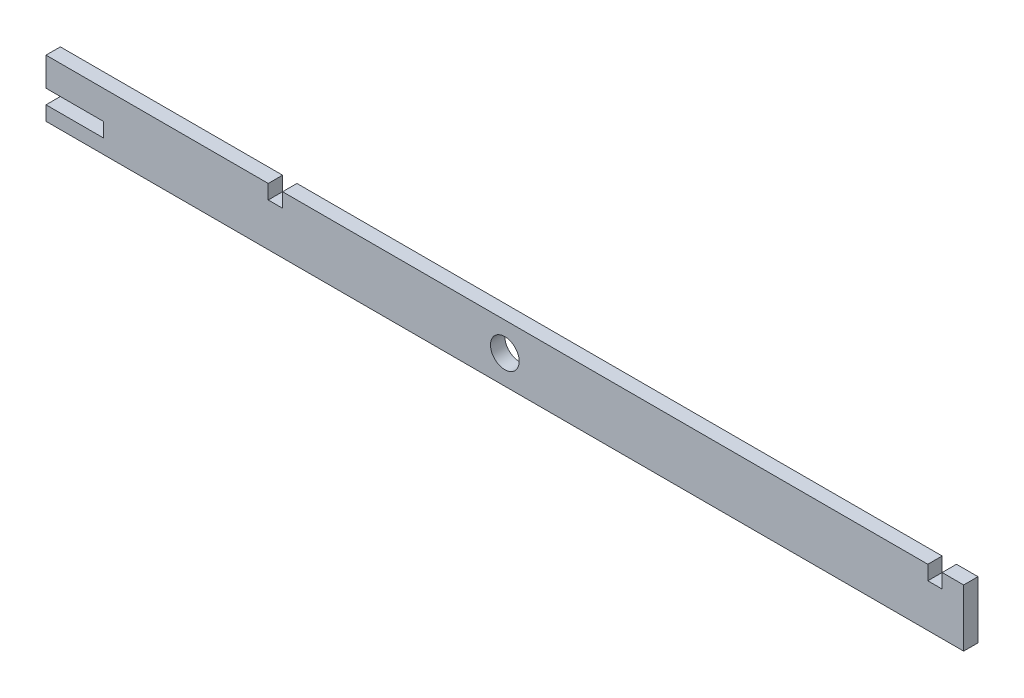
ISO-10303-21;
HEADER;
FILE_DESCRIPTION(('STEP AP214'),'2;1');
FILE_NAME('part.step','',(''),(''),'','','');
FILE_SCHEMA(('AUTOMOTIVE_DESIGN { 1 0 10303 214 1 1 1 1 }'));
ENDSEC;
DATA;
#1=APPLICATION_CONTEXT('core data for automotive mechanical design processes');
#2=APPLICATION_PROTOCOL_DEFINITION('international standard','automotive_design',2000,#1);
#3=PRODUCT_CONTEXT('',#1,'mechanical');
#4=PRODUCT('Part','Part','',(#3));
#5=PRODUCT_RELATED_PRODUCT_CATEGORY('part','',(#4));
#6=PRODUCT_DEFINITION_FORMATION('','',#4);
#7=PRODUCT_DEFINITION_CONTEXT('part definition',#1,'design');
#8=PRODUCT_DEFINITION('design','',#6,#7);
#9=PRODUCT_DEFINITION_SHAPE('','',#8);
#10=(LENGTH_UNIT() NAMED_UNIT(*) SI_UNIT(.MILLI.,.METRE.));
#11=(NAMED_UNIT(*) PLANE_ANGLE_UNIT() SI_UNIT($,.RADIAN.));
#12=(NAMED_UNIT(*) SI_UNIT($,.STERADIAN.) SOLID_ANGLE_UNIT());
#13=UNCERTAINTY_MEASURE_WITH_UNIT(LENGTH_MEASURE(1.E-05),#10,'distance_accuracy_value','');
#14=(GEOMETRIC_REPRESENTATION_CONTEXT(3) GLOBAL_UNCERTAINTY_ASSIGNED_CONTEXT((#13)) GLOBAL_UNIT_ASSIGNED_CONTEXT((#10,
#11,#12)) REPRESENTATION_CONTEXT('',''));
#15=CARTESIAN_POINT('',(0.,0.,0.));
#16=DIRECTION('',(0.,0.,1.));
#17=DIRECTION('',(1.,0.,0.));
#18=AXIS2_PLACEMENT_3D('',#15,#16,#17);
#19=CARTESIAN_POINT('',(0.,-3.17499999999999,3.175));
#20=DIRECTION('',(0.,1.,0.));
#21=DIRECTION('',(-1.,0.,0.));
#22=AXIS2_PLACEMENT_3D('',#19,#20,#21);
#23=PLANE('',#22);
#24=DIRECTION('',(1.,0.,0.));
#25=VECTOR('',#24,1.);
#26=CARTESIAN_POINT('',(0.,-3.17499999999999,0.));
#27=LINE('',#26,#25);
#28=CARTESIAN_POINT('',(-153.9875,-3.17500000000001,0.));
#29=VERTEX_POINT('',#28);
#30=CARTESIAN_POINT('',(-150.8125,-3.17500000000001,0.));
#31=VERTEX_POINT('',#30);
#32=EDGE_CURVE('E226',#29,#31,#27,.T.);
#33=ORIENTED_EDGE('',*,*,#32,.F.);
#34=DIRECTION('',(0.,0.,-1.));
#35=VECTOR('',#34,1.);
#36=CARTESIAN_POINT('',(-153.9875,-3.17500000000001,3.175));
#37=LINE('',#36,#35);
#38=CARTESIAN_POINT('',(-153.9875,-3.17500000000001,3.175));
#39=VERTEX_POINT('',#38);
#40=EDGE_CURVE('E11',#39,#29,#37,.T.);
#41=ORIENTED_EDGE('',*,*,#40,.F.);
#42=DIRECTION('',(1.,0.,0.));
#43=VECTOR('',#42,1.);
#44=CARTESIAN_POINT('',(0.,-3.17499999999999,3.175));
#45=LINE('',#44,#43);
#46=CARTESIAN_POINT('',(-150.8125,-3.17500000000001,3.175));
#47=VERTEX_POINT('',#46);
#48=EDGE_CURVE('E330',#39,#47,#45,.T.);
#49=ORIENTED_EDGE('',*,*,#48,.T.);
#50=DIRECTION('',(0.,0.,-1.));
#51=VECTOR('',#50,1.);
#52=CARTESIAN_POINT('',(-150.8125,-3.17500000000001,3.175));
#53=LINE('',#52,#51);
#54=EDGE_CURVE('E55',#47,#31,#53,.T.);
#55=ORIENTED_EDGE('',*,*,#54,.T.);
#56=EDGE_LOOP('',(#33,#41,#49,#55));
#57=FACE_BOUND('',#56,.T.);
#58=ADVANCED_FACE('F38',(#57),#23,.T.);
#59=CARTESIAN_POINT('',(-153.9875,0.,3.175));
#60=DIRECTION('',(-1.,0.,0.));
#61=DIRECTION('',(0.,0.,1.));
#62=AXIS2_PLACEMENT_3D('',#59,#60,#61);
#63=PLANE('',#62);
#64=DIRECTION('',(0.,1.,0.));
#65=VECTOR('',#64,1.);
#66=CARTESIAN_POINT('',(-153.9875,0.,0.));
#67=LINE('',#66,#65);
#68=CARTESIAN_POINT('',(-153.9875,0.,0.));
#69=VERTEX_POINT('',#68);
#70=EDGE_CURVE('E223',#29,#69,#67,.T.);
#71=ORIENTED_EDGE('',*,*,#70,.T.);
#72=DIRECTION('',(0.,0.,-1.));
#73=VECTOR('',#72,1.);
#74=CARTESIAN_POINT('',(-153.9875,0.,3.175));
#75=LINE('',#74,#73);
#76=CARTESIAN_POINT('',(-153.9875,0.,3.175));
#77=VERTEX_POINT('',#76);
#78=EDGE_CURVE('E47',#77,#69,#75,.T.);
#79=ORIENTED_EDGE('',*,*,#78,.F.);
#80=DIRECTION('',(0.,1.,0.));
#81=VECTOR('',#80,1.);
#82=CARTESIAN_POINT('',(-153.9875,0.,3.175));
#83=LINE('',#82,#81);
#84=EDGE_CURVE('E332',#39,#77,#83,.T.);
#85=ORIENTED_EDGE('',*,*,#84,.F.);
#86=ORIENTED_EDGE('',*,*,#40,.T.);
#87=EDGE_LOOP('',(#71,#79,#85,#86));
#88=FACE_BOUND('',#87,.T.);
#89=ADVANCED_FACE('F224',(#88),#63,.F.);
#90=CARTESIAN_POINT('',(0.,0.,3.175));
#91=DIRECTION('',(0.,-1.,0.));
#92=DIRECTION('',(1.,0.,0.));
#93=AXIS2_PLACEMENT_3D('',#90,#91,#92);
#94=PLANE('',#93);
#95=DIRECTION('',(-1.,0.,0.));
#96=VECTOR('',#95,1.);
#97=CARTESIAN_POINT('',(0.,0.,0.));
#98=LINE('',#97,#96);
#99=CARTESIAN_POINT('',(-203.2,0.,0.));
#100=VERTEX_POINT('',#99);
#101=EDGE_CURVE('E218',#69,#100,#98,.T.);
#102=ORIENTED_EDGE('',*,*,#101,.T.);
#103=DIRECTION('',(0.,0.,-1.));
#104=VECTOR('',#103,1.);
#105=CARTESIAN_POINT('',(-203.2,0.,3.175));
#106=LINE('',#105,#104);
#107=CARTESIAN_POINT('',(-203.2,0.,3.175));
#108=VERTEX_POINT('',#107);
#109=EDGE_CURVE('E209',#108,#100,#106,.T.);
#110=ORIENTED_EDGE('',*,*,#109,.F.);
#111=DIRECTION('',(-1.,0.,0.));
#112=VECTOR('',#111,1.);
#113=CARTESIAN_POINT('',(0.,0.,3.175));
#114=LINE('',#113,#112);
#115=EDGE_CURVE('E165',#77,#108,#114,.T.);
#116=ORIENTED_EDGE('',*,*,#115,.F.);
#117=ORIENTED_EDGE('',*,*,#78,.T.);
#118=EDGE_LOOP('',(#102,#110,#116,#117));
#119=FACE_BOUND('',#118,.T.);
#120=ADVANCED_FACE('F216',(#119),#94,.F.);
#121=CARTESIAN_POINT('',(-203.2,0.,3.175));
#122=DIRECTION('',(1.,0.,0.));
#123=DIRECTION('',(0.,0.,-1.));
#124=AXIS2_PLACEMENT_3D('',#121,#122,#123);
#125=PLANE('',#124);
#126=DIRECTION('',(0.,-1.,0.));
#127=VECTOR('',#126,1.);
#128=CARTESIAN_POINT('',(-203.2,0.,0.));
#129=LINE('',#128,#127);
#130=CARTESIAN_POINT('',(-203.2,-6.35,0.));
#131=VERTEX_POINT('',#130);
#132=EDGE_CURVE('E228',#100,#131,#129,.T.);
#133=ORIENTED_EDGE('',*,*,#132,.T.);
#134=DIRECTION('',(0.,0.,-1.));
#135=VECTOR('',#134,1.);
#136=CARTESIAN_POINT('',(-203.2,-6.35,3.175));
#137=LINE('',#136,#135);
#138=CARTESIAN_POINT('',(-203.2,-6.35,3.175));
#139=VERTEX_POINT('',#138);
#140=EDGE_CURVE('E206',#139,#131,#137,.T.);
#141=ORIENTED_EDGE('',*,*,#140,.F.);
#142=DIRECTION('',(0.,-1.,0.));
#143=VECTOR('',#142,1.);
#144=CARTESIAN_POINT('',(-203.2,0.,3.175));
#145=LINE('',#144,#143);
#146=EDGE_CURVE('E336',#108,#139,#145,.T.);
#147=ORIENTED_EDGE('',*,*,#146,.F.);
#148=ORIENTED_EDGE('',*,*,#109,.T.);
#149=EDGE_LOOP('',(#133,#141,#147,#148));
#150=FACE_BOUND('',#149,.T.);
#151=ADVANCED_FACE('F292',(#150),#125,.F.);
#152=CARTESIAN_POINT('',(0.,-6.34999999999999,3.175));
#153=DIRECTION('',(0.,1.,0.));
#154=DIRECTION('',(-1.,0.,0.));
#155=AXIS2_PLACEMENT_3D('',#152,#153,#154);
#156=PLANE('',#155);
#157=DIRECTION('',(1.,0.,0.));
#158=VECTOR('',#157,1.);
#159=CARTESIAN_POINT('',(0.,-6.34999999999999,0.));
#160=LINE('',#159,#158);
#161=CARTESIAN_POINT('',(-190.5,-6.35,0.));
#162=VERTEX_POINT('',#161);
#163=EDGE_CURVE('E238',#131,#162,#160,.T.);
#164=ORIENTED_EDGE('',*,*,#163,.T.);
#165=DIRECTION('',(0.,0.,-1.));
#166=VECTOR('',#165,1.);
#167=CARTESIAN_POINT('',(-190.5,-6.35,3.175));
#168=LINE('',#167,#166);
#169=CARTESIAN_POINT('',(-190.5,-6.35,3.175));
#170=VERTEX_POINT('',#169);
#171=EDGE_CURVE('E203',#170,#162,#168,.T.);
#172=ORIENTED_EDGE('',*,*,#171,.F.);
#173=DIRECTION('',(1.,0.,0.));
#174=VECTOR('',#173,1.);
#175=CARTESIAN_POINT('',(0.,-6.34999999999999,3.175));
#176=LINE('',#175,#174);
#177=EDGE_CURVE('E339',#139,#170,#176,.T.);
#178=ORIENTED_EDGE('',*,*,#177,.F.);
#179=ORIENTED_EDGE('',*,*,#140,.T.);
#180=EDGE_LOOP('',(#164,#172,#178,#179));
#181=FACE_BOUND('',#180,.T.);
#182=ADVANCED_FACE('F288',(#181),#156,.F.);
#183=CARTESIAN_POINT('',(-190.5,1.66533453693773E-12,3.175));
#184=DIRECTION('',(1.,0.,0.));
#185=DIRECTION('',(0.,1.,0.));
#186=AXIS2_PLACEMENT_3D('',#183,#184,#185);
#187=PLANE('',#186);
#188=DIRECTION('',(0.,-1.,0.));
#189=VECTOR('',#188,1.);
#190=CARTESIAN_POINT('',(-190.5,1.66533453693773E-12,0.));
#191=LINE('',#190,#189);
#192=CARTESIAN_POINT('',(-190.5,-9.52500000000001,0.));
#193=VERTEX_POINT('',#192);
#194=EDGE_CURVE('E242',#162,#193,#191,.T.);
#195=ORIENTED_EDGE('',*,*,#194,.T.);
#196=DIRECTION('',(0.,0.,-1.));
#197=VECTOR('',#196,1.);
#198=CARTESIAN_POINT('',(-190.5,-9.52500000000001,3.175));
#199=LINE('',#198,#197);
#200=CARTESIAN_POINT('',(-190.5,-9.52500000000001,3.175));
#201=VERTEX_POINT('',#200);
#202=EDGE_CURVE('E200',#201,#193,#199,.T.);
#203=ORIENTED_EDGE('',*,*,#202,.F.);
#204=DIRECTION('',(0.,-1.,0.));
#205=VECTOR('',#204,1.);
#206=CARTESIAN_POINT('',(-190.5,1.66533453693773E-12,3.175));
#207=LINE('',#206,#205);
#208=EDGE_CURVE('E343',#170,#201,#207,.T.);
#209=ORIENTED_EDGE('',*,*,#208,.F.);
#210=ORIENTED_EDGE('',*,*,#171,.T.);
#211=EDGE_LOOP('',(#195,#203,#209,#210));
#212=FACE_BOUND('',#211,.T.);
#213=ADVANCED_FACE('F291',(#212),#187,.F.);
#214=CARTESIAN_POINT('',(0.,-9.52499999999998,3.175));
#215=DIRECTION('',(0.,-1.,0.));
#216=DIRECTION('',(1.,0.,0.));
#217=AXIS2_PLACEMENT_3D('',#214,#215,#216);
#218=PLANE('',#217);
#219=DIRECTION('',(-1.,0.,0.));
#220=VECTOR('',#219,1.);
#221=CARTESIAN_POINT('',(0.,-9.52499999999998,0.));
#222=LINE('',#221,#220);
#223=CARTESIAN_POINT('',(-203.2,-9.52500000000001,0.));
#224=VERTEX_POINT('',#223);
#225=EDGE_CURVE('E245',#193,#224,#222,.T.);
#226=ORIENTED_EDGE('',*,*,#225,.T.);
#227=DIRECTION('',(0.,0.,-1.));
#228=VECTOR('',#227,1.);
#229=CARTESIAN_POINT('',(-203.2,-9.52500000000001,3.175));
#230=LINE('',#229,#228);
#231=CARTESIAN_POINT('',(-203.2,-9.52500000000001,3.175));
#232=VERTEX_POINT('',#231);
#233=EDGE_CURVE('E197',#232,#224,#230,.T.);
#234=ORIENTED_EDGE('',*,*,#233,.F.);
#235=DIRECTION('',(-1.,0.,0.));
#236=VECTOR('',#235,1.);
#237=CARTESIAN_POINT('',(0.,-9.52499999999998,3.175));
#238=LINE('',#237,#236);
#239=EDGE_CURVE('E346',#201,#232,#238,.T.);
#240=ORIENTED_EDGE('',*,*,#239,.F.);
#241=ORIENTED_EDGE('',*,*,#202,.T.);
#242=EDGE_LOOP('',(#226,#234,#240,#241));
#243=FACE_BOUND('',#242,.T.);
#244=ADVANCED_FACE('F296',(#243),#218,.F.);
#245=CARTESIAN_POINT('',(-203.2,-12.7,0.));
#246=VERTEX_POINT('',#245);
#247=EDGE_CURVE('E239',#224,#246,#129,.T.);
#248=ORIENTED_EDGE('',*,*,#247,.T.);
#249=DIRECTION('',(0.,0.,-1.));
#250=VECTOR('',#249,1.);
#251=CARTESIAN_POINT('',(-203.2,-12.7,3.175));
#252=LINE('',#251,#250);
#253=CARTESIAN_POINT('',(-203.2,-12.7,3.175));
#254=VERTEX_POINT('',#253);
#255=EDGE_CURVE('E194',#254,#246,#252,.T.);
#256=ORIENTED_EDGE('',*,*,#255,.F.);
#257=EDGE_CURVE('E340',#232,#254,#145,.T.);
#258=ORIENTED_EDGE('',*,*,#257,.F.);
#259=ORIENTED_EDGE('',*,*,#233,.T.);
#260=EDGE_LOOP('',(#248,#256,#258,#259));
#261=FACE_BOUND('',#260,.T.);
#262=ADVANCED_FACE('F300',(#261),#125,.F.);
#263=CARTESIAN_POINT('',(0.,-12.7,3.175));
#264=DIRECTION('',(0.,1.,0.));
#265=DIRECTION('',(0.,0.,1.));
#266=AXIS2_PLACEMENT_3D('',#263,#264,#265);
#267=PLANE('',#266);
#268=DIRECTION('',(1.,0.,0.));
#269=VECTOR('',#268,1.);
#270=CARTESIAN_POINT('',(0.,-12.7,0.));
#271=LINE('',#270,#269);
#272=CARTESIAN_POINT('',(0.,-12.7,0.));
#273=VERTEX_POINT('',#272);
#274=EDGE_CURVE('E248',#246,#273,#271,.T.);
#275=ORIENTED_EDGE('',*,*,#274,.T.);
#276=DIRECTION('',(0.,0.,-1.));
#277=VECTOR('',#276,1.);
#278=CARTESIAN_POINT('',(0.,-12.7,3.175));
#279=LINE('',#278,#277);
#280=CARTESIAN_POINT('',(0.,-12.7,3.175));
#281=VERTEX_POINT('',#280);
#282=EDGE_CURVE('E191',#281,#273,#279,.T.);
#283=ORIENTED_EDGE('',*,*,#282,.F.);
#284=DIRECTION('',(1.,0.,0.));
#285=VECTOR('',#284,1.);
#286=CARTESIAN_POINT('',(0.,-12.7,3.175));
#287=LINE('',#286,#285);
#288=EDGE_CURVE('E349',#254,#281,#287,.T.);
#289=ORIENTED_EDGE('',*,*,#288,.F.);
#290=ORIENTED_EDGE('',*,*,#255,.T.);
#291=EDGE_LOOP('',(#275,#283,#289,#290));
#292=FACE_BOUND('',#291,.T.);
#293=ADVANCED_FACE('F304',(#292),#267,.F.);
#294=CARTESIAN_POINT('',(0.,0.,3.175));
#295=DIRECTION('',(-1.,0.,0.));
#296=DIRECTION('',(0.,0.,1.));
#297=AXIS2_PLACEMENT_3D('',#294,#295,#296);
#298=PLANE('',#297);
#299=DIRECTION('',(0.,1.,0.));
#300=VECTOR('',#299,1.);
#301=CARTESIAN_POINT('',(0.,0.,0.));
#302=LINE('',#301,#300);
#303=CARTESIAN_POINT('',(0.,0.,0.));
#304=VERTEX_POINT('',#303);
#305=EDGE_CURVE('E251',#273,#304,#302,.T.);
#306=ORIENTED_EDGE('',*,*,#305,.T.);
#307=DIRECTION('',(0.,0.,-1.));
#308=VECTOR('',#307,1.);
#309=CARTESIAN_POINT('',(0.,0.,3.175));
#310=LINE('',#309,#308);
#311=CARTESIAN_POINT('',(0.,0.,3.175));
#312=VERTEX_POINT('',#311);
#313=EDGE_CURVE('E188',#312,#304,#310,.T.);
#314=ORIENTED_EDGE('',*,*,#313,.F.);
#315=DIRECTION('',(0.,1.,0.));
#316=VECTOR('',#315,1.);
#317=CARTESIAN_POINT('',(0.,0.,3.175));
#318=LINE('',#317,#316);
#319=EDGE_CURVE('E352',#281,#312,#318,.T.);
#320=ORIENTED_EDGE('',*,*,#319,.F.);
#321=ORIENTED_EDGE('',*,*,#282,.T.);
#322=EDGE_LOOP('',(#306,#314,#320,#321));
#323=FACE_BOUND('',#322,.T.);
#324=ADVANCED_FACE('F308',(#323),#298,.F.);
#325=CARTESIAN_POINT('',(-4.7625,0.,0.));
#326=VERTEX_POINT('',#325);
#327=EDGE_CURVE('E231',#304,#326,#98,.T.);
#328=ORIENTED_EDGE('',*,*,#327,.T.);
#329=DIRECTION('',(0.,0.,-1.));
#330=VECTOR('',#329,1.);
#331=CARTESIAN_POINT('',(-4.7625,0.,3.175));
#332=LINE('',#331,#330);
#333=CARTESIAN_POINT('',(-4.7625,0.,3.175));
#334=VERTEX_POINT('',#333);
#335=EDGE_CURVE('E186',#334,#326,#332,.T.);
#336=ORIENTED_EDGE('',*,*,#335,.F.);
#337=EDGE_CURVE('E164',#312,#334,#114,.T.);
#338=ORIENTED_EDGE('',*,*,#337,.F.);
#339=ORIENTED_EDGE('',*,*,#313,.T.);
#340=EDGE_LOOP('',(#328,#336,#338,#339));
#341=FACE_BOUND('',#340,.T.);
#342=ADVANCED_FACE('F280',(#341),#94,.F.);
#343=CARTESIAN_POINT('',(-4.7625,0.,3.175));
#344=DIRECTION('',(-1.,0.,0.));
#345=DIRECTION('',(0.,0.,1.));
#346=AXIS2_PLACEMENT_3D('',#343,#344,#345);
#347=PLANE('',#346);
#348=DIRECTION('',(0.,1.,0.));
#349=VECTOR('',#348,1.);
#350=CARTESIAN_POINT('',(-4.7625,0.,0.));
#351=LINE('',#350,#349);
#352=CARTESIAN_POINT('',(-4.7625,-3.175,0.));
#353=VERTEX_POINT('',#352);
#354=EDGE_CURVE('E254',#353,#326,#351,.T.);
#355=ORIENTED_EDGE('',*,*,#354,.F.);
#356=DIRECTION('',(0.,0.,-1.));
#357=VECTOR('',#356,1.);
#358=CARTESIAN_POINT('',(-4.7625,-3.175,3.175));
#359=LINE('',#358,#357);
#360=CARTESIAN_POINT('',(-4.7625,-3.175,3.175));
#361=VERTEX_POINT('',#360);
#362=EDGE_CURVE('E180',#361,#353,#359,.T.);
#363=ORIENTED_EDGE('',*,*,#362,.F.);
#364=DIRECTION('',(0.,1.,0.));
#365=VECTOR('',#364,1.);
#366=CARTESIAN_POINT('',(-4.7625,0.,3.175));
#367=LINE('',#366,#365);
#368=EDGE_CURVE('E355',#361,#334,#367,.T.);
#369=ORIENTED_EDGE('',*,*,#368,.T.);
#370=ORIENTED_EDGE('',*,*,#335,.T.);
#371=EDGE_LOOP('',(#355,#363,#369,#370));
#372=FACE_BOUND('',#371,.T.);
#373=ADVANCED_FACE('F313',(#372),#347,.T.);
#374=CARTESIAN_POINT('',(0.,-3.175,3.175));
#375=DIRECTION('',(0.,1.,0.));
#376=DIRECTION('',(-1.,0.,0.));
#377=AXIS2_PLACEMENT_3D('',#374,#375,#376);
#378=PLANE('',#377);
#379=DIRECTION('',(1.,0.,0.));
#380=VECTOR('',#379,1.);
#381=CARTESIAN_POINT('',(0.,-3.175,0.));
#382=LINE('',#381,#380);
#383=CARTESIAN_POINT('',(-7.9375,-3.175,0.));
#384=VERTEX_POINT('',#383);
#385=EDGE_CURVE('E257',#384,#353,#382,.T.);
#386=ORIENTED_EDGE('',*,*,#385,.F.);
#387=DIRECTION('',(0.,0.,-1.));
#388=VECTOR('',#387,1.);
#389=CARTESIAN_POINT('',(-7.9375,-3.175,3.175));
#390=LINE('',#389,#388);
#391=CARTESIAN_POINT('',(-7.9375,-3.175,3.175));
#392=VERTEX_POINT('',#391);
#393=EDGE_CURVE('E178',#392,#384,#390,.T.);
#394=ORIENTED_EDGE('',*,*,#393,.F.);
#395=DIRECTION('',(1.,0.,0.));
#396=VECTOR('',#395,1.);
#397=CARTESIAN_POINT('',(0.,-3.175,3.175));
#398=LINE('',#397,#396);
#399=EDGE_CURVE('E172',#392,#361,#398,.T.);
#400=ORIENTED_EDGE('',*,*,#399,.T.);
#401=ORIENTED_EDGE('',*,*,#362,.T.);
#402=EDGE_LOOP('',(#386,#394,#400,#401));
#403=FACE_BOUND('',#402,.T.);
#404=ADVANCED_FACE('F316',(#403),#378,.T.);
#405=CARTESIAN_POINT('',(-7.9375,0.,3.175));
#406=DIRECTION('',(-1.,0.,0.));
#407=DIRECTION('',(0.,0.,1.));
#408=AXIS2_PLACEMENT_3D('',#405,#406,#407);
#409=PLANE('',#408);
#410=DIRECTION('',(0.,1.,0.));
#411=VECTOR('',#410,1.);
#412=CARTESIAN_POINT('',(-7.9375,0.,0.));
#413=LINE('',#412,#411);
#414=CARTESIAN_POINT('',(-7.9375,0.,0.));
#415=VERTEX_POINT('',#414);
#416=EDGE_CURVE('E177',#384,#415,#413,.T.);
#417=ORIENTED_EDGE('',*,*,#416,.T.);
#418=DIRECTION('',(0.,0.,-1.));
#419=VECTOR('',#418,1.);
#420=CARTESIAN_POINT('',(-7.9375,0.,3.175));
#421=LINE('',#420,#419);
#422=CARTESIAN_POINT('',(-7.9375,0.,3.175));
#423=VERTEX_POINT('',#422);
#424=EDGE_CURVE('E157',#423,#415,#421,.T.);
#425=ORIENTED_EDGE('',*,*,#424,.F.);
#426=DIRECTION('',(0.,1.,0.));
#427=VECTOR('',#426,1.);
#428=CARTESIAN_POINT('',(-7.9375,0.,3.175));
#429=LINE('',#428,#427);
#430=EDGE_CURVE('E162',#392,#423,#429,.T.);
#431=ORIENTED_EDGE('',*,*,#430,.F.);
#432=ORIENTED_EDGE('',*,*,#393,.T.);
#433=EDGE_LOOP('',(#417,#425,#431,#432));
#434=FACE_BOUND('',#433,.T.);
#435=ADVANCED_FACE('F175',(#434),#409,.F.);
#436=CARTESIAN_POINT('',(-150.8125,0.,0.));
#437=VERTEX_POINT('',#436);
#438=EDGE_CURVE('E230',#415,#437,#98,.T.);
#439=ORIENTED_EDGE('',*,*,#438,.T.);
#440=DIRECTION('',(0.,0.,-1.));
#441=VECTOR('',#440,1.);
#442=CARTESIAN_POINT('',(-150.8125,0.,3.175));
#443=LINE('',#442,#441);
#444=CARTESIAN_POINT('',(-150.8125,0.,3.175));
#445=VERTEX_POINT('',#444);
#446=EDGE_CURVE('E105',#445,#437,#443,.T.);
#447=ORIENTED_EDGE('',*,*,#446,.F.);
#448=EDGE_CURVE('E153',#423,#445,#114,.T.);
#449=ORIENTED_EDGE('',*,*,#448,.F.);
#450=ORIENTED_EDGE('',*,*,#424,.T.);
#451=EDGE_LOOP('',(#439,#447,#449,#450));
#452=FACE_BOUND('',#451,.T.);
#453=ADVANCED_FACE('F155',(#452),#94,.F.);
#454=CARTESIAN_POINT('',(-101.6,-6.35000000000001,3.175));
#455=DIRECTION('',(0.,0.,-1.));
#456=DIRECTION('',(-1.,0.,0.));
#457=AXIS2_PLACEMENT_3D('',#454,#455,#456);
#458=CYLINDRICAL_SURFACE('',#457,3.17500000000001);
#459=CARTESIAN_POINT('',(-101.6,-6.35000000000001,3.175));
#460=DIRECTION('',(0.,0.,1.));
#461=DIRECTION('',(1.,0.,0.));
#462=AXIS2_PLACEMENT_3D('',#459,#460,#461);
#463=CIRCLE('',#462,3.17500000000001);
#464=CARTESIAN_POINT('',(-98.425,-6.35000000000001,3.175));
#465=VERTEX_POINT('',#464);
#466=EDGE_CURVE('E263',#465,#465,#463,.T.);
#467=ORIENTED_EDGE('',*,*,#466,.T.);
#468=EDGE_LOOP('',(#467));
#469=FACE_BOUND('',#468,.T.);
#470=CARTESIAN_POINT('',(-101.6,-6.35000000000001,0.));
#471=DIRECTION('',(0.,0.,1.));
#472=DIRECTION('',(1.,0.,0.));
#473=AXIS2_PLACEMENT_3D('',#470,#471,#472);
#474=CIRCLE('',#473,3.17500000000001);
#475=CARTESIAN_POINT('',(-98.425,-6.35000000000001,0.));
#476=VERTEX_POINT('',#475);
#477=EDGE_CURVE('E232',#476,#476,#474,.T.);
#478=ORIENTED_EDGE('',*,*,#477,.F.);
#479=EDGE_LOOP('',(#478));
#480=FACE_BOUND('',#479,.T.);
#481=ADVANCED_FACE('F40',(#469,#480),#458,.F.);
#482=CARTESIAN_POINT('',(-150.8125,0.,3.175));
#483=DIRECTION('',(-1.,0.,0.));
#484=DIRECTION('',(0.,0.,1.));
#485=AXIS2_PLACEMENT_3D('',#482,#483,#484);
#486=PLANE('',#485);
#487=DIRECTION('',(0.,1.,0.));
#488=VECTOR('',#487,1.);
#489=CARTESIAN_POINT('',(-150.8125,0.,0.));
#490=LINE('',#489,#488);
#491=EDGE_CURVE('E261',#31,#437,#490,.T.);
#492=ORIENTED_EDGE('',*,*,#491,.F.);
#493=ORIENTED_EDGE('',*,*,#54,.F.);
#494=DIRECTION('',(0.,1.,0.));
#495=VECTOR('',#494,1.);
#496=CARTESIAN_POINT('',(-150.8125,0.,3.175));
#497=LINE('',#496,#495);
#498=EDGE_CURVE('E161',#47,#445,#497,.T.);
#499=ORIENTED_EDGE('',*,*,#498,.T.);
#500=ORIENTED_EDGE('',*,*,#446,.T.);
#501=EDGE_LOOP('',(#492,#493,#499,#500));
#502=FACE_BOUND('',#501,.T.);
#503=ADVANCED_FACE('F272',(#502),#486,.T.);
#504=CARTESIAN_POINT('',(0.,0.,3.175));
#505=DIRECTION('',(0.,0.,1.));
#506=DIRECTION('',(1.,0.,0.));
#507=AXIS2_PLACEMENT_3D('',#504,#505,#506);
#508=PLANE('',#507);
#509=ORIENTED_EDGE('',*,*,#466,.F.);
#510=EDGE_LOOP('',(#509));
#511=FACE_BOUND('',#510,.T.);
#512=ORIENTED_EDGE('',*,*,#48,.F.);
#513=ORIENTED_EDGE('',*,*,#84,.T.);
#514=ORIENTED_EDGE('',*,*,#115,.T.);
#515=ORIENTED_EDGE('',*,*,#146,.T.);
#516=ORIENTED_EDGE('',*,*,#177,.T.);
#517=ORIENTED_EDGE('',*,*,#208,.T.);
#518=ORIENTED_EDGE('',*,*,#239,.T.);
#519=ORIENTED_EDGE('',*,*,#257,.T.);
#520=ORIENTED_EDGE('',*,*,#288,.T.);
#521=ORIENTED_EDGE('',*,*,#319,.T.);
#522=ORIENTED_EDGE('',*,*,#337,.T.);
#523=ORIENTED_EDGE('',*,*,#368,.F.);
#524=ORIENTED_EDGE('',*,*,#399,.F.);
#525=ORIENTED_EDGE('',*,*,#430,.T.);
#526=ORIENTED_EDGE('',*,*,#448,.T.);
#527=ORIENTED_EDGE('',*,*,#498,.F.);
#528=EDGE_LOOP('',(#512,#513,#514,#515,#516,#517,#518,#519,#520,#521,#522,#523,#524,#525,#526,#527));
#529=FACE_BOUND('',#528,.T.);
#530=ADVANCED_FACE('F169',(#511,#529),#508,.T.);
#531=CARTESIAN_POINT('',(0.,0.,0.));
#532=DIRECTION('',(0.,0.,1.));
#533=DIRECTION('',(1.,0.,0.));
#534=AXIS2_PLACEMENT_3D('',#531,#532,#533);
#535=PLANE('',#534);
#536=ORIENTED_EDGE('',*,*,#477,.T.);
#537=EDGE_LOOP('',(#536));
#538=FACE_BOUND('',#537,.T.);
#539=ORIENTED_EDGE('',*,*,#32,.T.);
#540=ORIENTED_EDGE('',*,*,#491,.T.);
#541=ORIENTED_EDGE('',*,*,#438,.F.);
#542=ORIENTED_EDGE('',*,*,#416,.F.);
#543=ORIENTED_EDGE('',*,*,#385,.T.);
#544=ORIENTED_EDGE('',*,*,#354,.T.);
#545=ORIENTED_EDGE('',*,*,#327,.F.);
#546=ORIENTED_EDGE('',*,*,#305,.F.);
#547=ORIENTED_EDGE('',*,*,#274,.F.);
#548=ORIENTED_EDGE('',*,*,#247,.F.);
#549=ORIENTED_EDGE('',*,*,#225,.F.);
#550=ORIENTED_EDGE('',*,*,#194,.F.);
#551=ORIENTED_EDGE('',*,*,#163,.F.);
#552=ORIENTED_EDGE('',*,*,#132,.F.);
#553=ORIENTED_EDGE('',*,*,#101,.F.);
#554=ORIENTED_EDGE('',*,*,#70,.F.);
#555=EDGE_LOOP('',(#539,#540,#541,#542,#543,#544,#545,#546,#547,#548,#549,#550,#551,#552,#553,#554));
#556=FACE_BOUND('',#555,.T.);
#557=ADVANCED_FACE('F269',(#538,#556),#535,.F.);
#558=CLOSED_SHELL('',(#58,#89,#120,#151,#182,#213,#244,#262,#293,#324,#342,#373,#404,#435,#453,
#481,#503,#530,#557));
#559=MANIFOLD_SOLID_BREP('B2',#558);
#560=ADVANCED_BREP_SHAPE_REPRESENTATION('',(#18,#559),#14);
#561=SHAPE_DEFINITION_REPRESENTATION(#9,#560);
ENDSEC;
END-ISO-10303-21;
